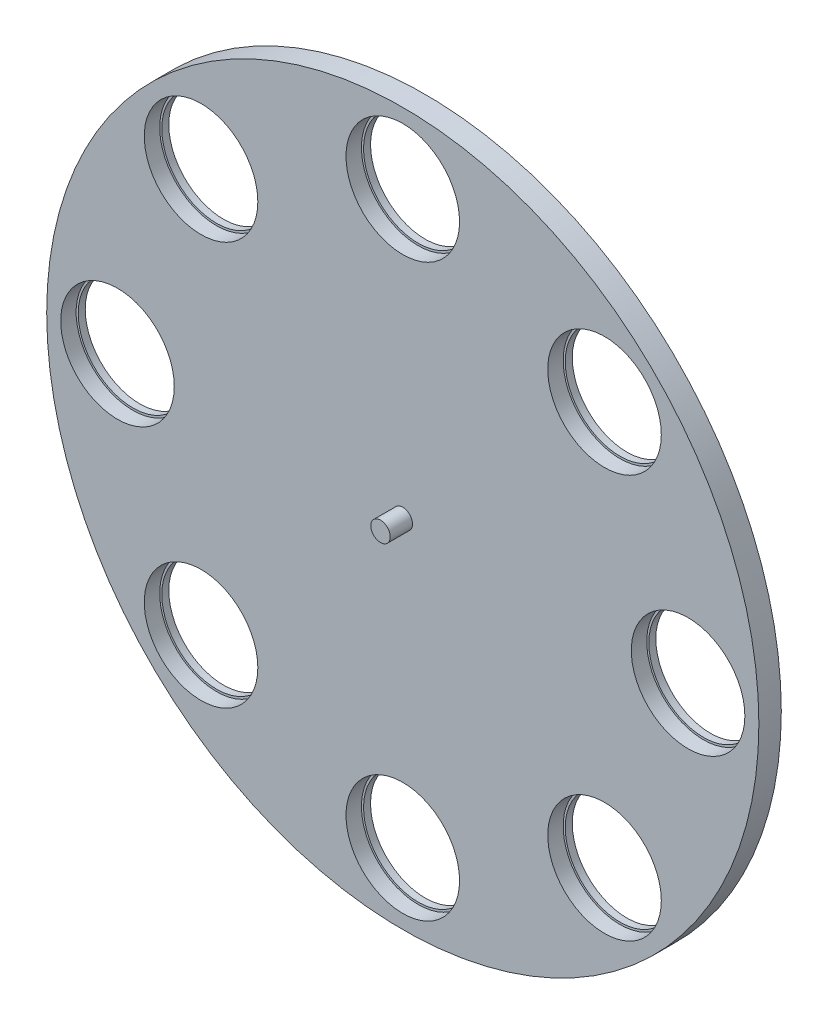
ISO-10303-21;
HEADER;
FILE_DESCRIPTION(('STEP AP214'),'2;1');
FILE_NAME('part.step','',(''),(''),'','','');
FILE_SCHEMA(('AUTOMOTIVE_DESIGN { 1 0 10303 214 1 1 1 1 }'));
ENDSEC;
DATA;
#1=APPLICATION_CONTEXT('core data for automotive mechanical design processes');
#2=APPLICATION_PROTOCOL_DEFINITION('international standard','automotive_design',2000,#1);
#3=PRODUCT_CONTEXT('',#1,'mechanical');
#4=PRODUCT('Part','Part','',(#3));
#5=PRODUCT_RELATED_PRODUCT_CATEGORY('part','',(#4));
#6=PRODUCT_DEFINITION_FORMATION('','',#4);
#7=PRODUCT_DEFINITION_CONTEXT('part definition',#1,'design');
#8=PRODUCT_DEFINITION('design','',#6,#7);
#9=PRODUCT_DEFINITION_SHAPE('','',#8);
#10=(LENGTH_UNIT() NAMED_UNIT(*) SI_UNIT(.MILLI.,.METRE.));
#11=(NAMED_UNIT(*) PLANE_ANGLE_UNIT() SI_UNIT($,.RADIAN.));
#12=(NAMED_UNIT(*) SI_UNIT($,.STERADIAN.) SOLID_ANGLE_UNIT());
#13=UNCERTAINTY_MEASURE_WITH_UNIT(LENGTH_MEASURE(1.E-05),#10,'distance_accuracy_value','');
#14=(GEOMETRIC_REPRESENTATION_CONTEXT(3) GLOBAL_UNCERTAINTY_ASSIGNED_CONTEXT((#13)) GLOBAL_UNIT_ASSIGNED_CONTEXT((#10,
#11,#12)) REPRESENTATION_CONTEXT('',''));
#15=CARTESIAN_POINT('',(0.,0.,0.));
#16=DIRECTION('',(0.,0.,1.));
#17=DIRECTION('',(1.,0.,0.));
#18=AXIS2_PLACEMENT_3D('',#15,#16,#17);
#19=CARTESIAN_POINT('',(0.,0.,1.1));
#20=DIRECTION('',(0.,0.,1.));
#21=DIRECTION('',(1.,0.,0.));
#22=AXIS2_PLACEMENT_3D('',#19,#20,#21);
#23=PLANE('',#22);
#24=CARTESIAN_POINT('',(0.,0.,1.1));
#25=DIRECTION('',(0.,0.,1.));
#26=DIRECTION('',(1.,0.,0.));
#27=AXIS2_PLACEMENT_3D('',#24,#25,#26);
#28=CIRCLE('',#27,0.69375);
#29=CARTESIAN_POINT('',(0.69375,0.,1.1));
#30=VERTEX_POINT('',#29);
#31=EDGE_CURVE('E104',#30,#30,#28,.T.);
#32=ORIENTED_EDGE('',*,*,#31,.F.);
#33=EDGE_LOOP('',(#32));
#34=FACE_BOUND('',#33,.T.);
#35=CARTESIAN_POINT('',(-20.3499999999993,-7.18332019120938E-13,1.1));
#36=DIRECTION('',(0.,0.,1.));
#37=DIRECTION('',(1.,0.,0.));
#38=AXIS2_PLACEMENT_3D('',#35,#36,#37);
#39=CIRCLE('',#38,4.05);
#40=CARTESIAN_POINT('',(-16.2999999999993,-7.18332019120938E-13,1.1));
#41=VERTEX_POINT('',#40);
#42=EDGE_CURVE('E89',#41,#41,#39,.T.);
#43=ORIENTED_EDGE('',*,*,#42,.F.);
#44=EDGE_LOOP('',(#43));
#45=FACE_BOUND('',#44,.T.);
#46=CARTESIAN_POINT('',(1.43167972576935E-12,-20.35,1.1));
#47=DIRECTION('',(0.,0.,1.));
#48=DIRECTION('',(1.,0.,0.));
#49=AXIS2_PLACEMENT_3D('',#46,#47,#48);
#50=CIRCLE('',#49,4.05);
#51=CARTESIAN_POINT('',(4.05000000000143,-20.35,1.1));
#52=VERTEX_POINT('',#51);
#53=EDGE_CURVE('E77',#52,#52,#50,.T.);
#54=ORIENTED_EDGE('',*,*,#53,.F.);
#55=EDGE_LOOP('',(#54));
#56=FACE_BOUND('',#55,.T.);
#57=CARTESIAN_POINT('',(20.3500000000007,7.15839862884673E-13,1.1));
#58=DIRECTION('',(0.,0.,1.));
#59=DIRECTION('',(1.,0.,0.));
#60=AXIS2_PLACEMENT_3D('',#57,#58,#59);
#61=CIRCLE('',#60,4.05);
#62=CARTESIAN_POINT('',(24.4000000000007,7.15839862884673E-13,1.1));
#63=VERTEX_POINT('',#62);
#64=EDGE_CURVE('E65',#63,#63,#61,.T.);
#65=ORIENTED_EDGE('',*,*,#64,.F.);
#66=EDGE_LOOP('',(#65));
#67=FACE_BOUND('',#66,.T.);
#68=CARTESIAN_POINT('',(0.,20.35,1.1));
#69=DIRECTION('',(0.,0.,1.));
#70=DIRECTION('',(1.,0.,0.));
#71=AXIS2_PLACEMENT_3D('',#68,#69,#70);
#72=CIRCLE('',#71,4.05);
#73=CARTESIAN_POINT('',(4.05,20.35,1.1));
#74=VERTEX_POINT('',#73);
#75=EDGE_CURVE('E51',#74,#74,#72,.T.);
#76=ORIENTED_EDGE('',*,*,#75,.F.);
#77=EDGE_LOOP('',(#76));
#78=FACE_BOUND('',#77,.T.);
#79=CARTESIAN_POINT('',(0.,0.,1.1));
#80=DIRECTION('',(0.,0.,1.));
#81=DIRECTION('',(1.,0.,0.));
#82=AXIS2_PLACEMENT_3D('',#79,#80,#81);
#83=CIRCLE('',#82,25.4);
#84=CARTESIAN_POINT('',(25.4,0.,1.1));
#85=VERTEX_POINT('',#84);
#86=EDGE_CURVE('E12',#85,#85,#83,.T.);
#87=ORIENTED_EDGE('',*,*,#86,.T.);
#88=EDGE_LOOP('',(#87));
#89=FACE_BOUND('',#88,.T.);
#90=CARTESIAN_POINT('',(14.3896229971464,14.3896229971468,1.1));
#91=DIRECTION('',(0.,0.,1.));
#92=DIRECTION('',(1.,0.,0.));
#93=AXIS2_PLACEMENT_3D('',#90,#91,#92);
#94=CIRCLE('',#93,4.05);
#95=CARTESIAN_POINT('',(18.4396229971465,14.3896229971468,1.1));
#96=VERTEX_POINT('',#95);
#97=EDGE_CURVE('E60',#96,#96,#94,.T.);
#98=ORIENTED_EDGE('',*,*,#97,.F.);
#99=EDGE_LOOP('',(#98));
#100=FACE_BOUND('',#99,.T.);
#101=CARTESIAN_POINT('',(14.3896229971475,-14.3896229971457,1.1));
#102=DIRECTION('',(0.,0.,1.));
#103=DIRECTION('',(1.,0.,0.));
#104=AXIS2_PLACEMENT_3D('',#101,#102,#103);
#105=CIRCLE('',#104,4.05);
#106=CARTESIAN_POINT('',(18.4396229971475,-14.3896229971457,1.1));
#107=VERTEX_POINT('',#106);
#108=EDGE_CURVE('E71',#107,#107,#105,.T.);
#109=ORIENTED_EDGE('',*,*,#108,.F.);
#110=EDGE_LOOP('',(#109));
#111=FACE_BOUND('',#110,.T.);
#112=CARTESIAN_POINT('',(-14.389622997145,-14.3896229971468,1.1));
#113=DIRECTION('',(0.,0.,1.));
#114=DIRECTION('',(1.,0.,0.));
#115=AXIS2_PLACEMENT_3D('',#112,#113,#114);
#116=CIRCLE('',#115,4.05);
#117=CARTESIAN_POINT('',(-10.339622997145,-14.3896229971468,1.1));
#118=VERTEX_POINT('',#117);
#119=EDGE_CURVE('E83',#118,#118,#116,.T.);
#120=ORIENTED_EDGE('',*,*,#119,.F.);
#121=EDGE_LOOP('',(#120));
#122=FACE_BOUND('',#121,.T.);
#123=CARTESIAN_POINT('',(-14.389622997146,14.3896229971457,1.1));
#124=DIRECTION('',(0.,0.,1.));
#125=DIRECTION('',(1.,0.,0.));
#126=AXIS2_PLACEMENT_3D('',#123,#124,#125);
#127=CIRCLE('',#126,4.05);
#128=CARTESIAN_POINT('',(-10.339622997146,14.3896229971457,1.1));
#129=VERTEX_POINT('',#128);
#130=EDGE_CURVE('E95',#129,#129,#127,.T.);
#131=ORIENTED_EDGE('',*,*,#130,.F.);
#132=EDGE_LOOP('',(#131));
#133=FACE_BOUND('',#132,.T.);
#134=ADVANCED_FACE('F44',(#34,#45,#56,#67,#78,#89,#100,#111,#122,#133),#23,.T.);
#135=CARTESIAN_POINT('',(0.,0.,1.1));
#136=DIRECTION('',(0.,0.,-1.));
#137=DIRECTION('',(-1.,0.,0.));
#138=AXIS2_PLACEMENT_3D('',#135,#136,#137);
#139=CYLINDRICAL_SURFACE('',#138,25.4);
#140=ORIENTED_EDGE('',*,*,#86,.F.);
#141=EDGE_LOOP('',(#140));
#142=FACE_BOUND('',#141,.T.);
#143=CARTESIAN_POINT('',(0.,0.,-0.5));
#144=DIRECTION('',(0.,0.,-1.));
#145=DIRECTION('',(-1.,0.,0.));
#146=AXIS2_PLACEMENT_3D('',#143,#144,#145);
#147=CIRCLE('',#146,25.4);
#148=CARTESIAN_POINT('',(-25.4,0.,-0.5));
#149=VERTEX_POINT('',#148);
#150=EDGE_CURVE('E107',#149,#149,#147,.T.);
#151=ORIENTED_EDGE('',*,*,#150,.F.);
#152=EDGE_LOOP('',(#151));
#153=FACE_BOUND('',#152,.T.);
#154=ADVANCED_FACE('F46',(#142,#153),#139,.T.);
#155=CARTESIAN_POINT('',(0.,20.35,1.1));
#156=DIRECTION('',(0.,0.,-1.));
#157=DIRECTION('',(-1.,0.,0.));
#158=AXIS2_PLACEMENT_3D('',#155,#156,#157);
#159=CYLINDRICAL_SURFACE('',#158,4.05);
#160=ORIENTED_EDGE('',*,*,#75,.T.);
#161=EDGE_LOOP('',(#160));
#162=FACE_BOUND('',#161,.T.);
#163=CARTESIAN_POINT('',(0.,20.35,0.));
#164=DIRECTION('',(0.,0.,1.));
#165=DIRECTION('',(1.,0.,0.));
#166=AXIS2_PLACEMENT_3D('',#163,#164,#165);
#167=CIRCLE('',#166,4.05);
#168=CARTESIAN_POINT('',(4.05,20.35,0.));
#169=VERTEX_POINT('',#168);
#170=EDGE_CURVE('E55',#169,#169,#167,.T.);
#171=ORIENTED_EDGE('',*,*,#170,.F.);
#172=EDGE_LOOP('',(#171));
#173=FACE_BOUND('',#172,.T.);
#174=ADVANCED_FACE('F188',(#162,#173),#159,.F.);
#175=CARTESIAN_POINT('',(14.3896229971464,14.3896229971468,1.1));
#176=DIRECTION('',(0.,0.,-1.));
#177=DIRECTION('',(-1.,0.,0.));
#178=AXIS2_PLACEMENT_3D('',#175,#176,#177);
#179=CYLINDRICAL_SURFACE('',#178,4.05);
#180=ORIENTED_EDGE('',*,*,#97,.T.);
#181=EDGE_LOOP('',(#180));
#182=FACE_BOUND('',#181,.T.);
#183=CARTESIAN_POINT('',(14.3896229971464,14.3896229971468,0.));
#184=DIRECTION('',(0.,0.,1.));
#185=DIRECTION('',(1.,0.,0.));
#186=AXIS2_PLACEMENT_3D('',#183,#184,#185);
#187=CIRCLE('',#186,4.05);
#188=CARTESIAN_POINT('',(18.4396229971465,14.3896229971468,0.));
#189=VERTEX_POINT('',#188);
#190=EDGE_CURVE('E62',#189,#189,#187,.T.);
#191=ORIENTED_EDGE('',*,*,#190,.F.);
#192=EDGE_LOOP('',(#191));
#193=FACE_BOUND('',#192,.T.);
#194=ADVANCED_FACE('F195',(#182,#193),#179,.F.);
#195=CARTESIAN_POINT('',(20.3500000000007,7.15839862884673E-13,1.1));
#196=DIRECTION('',(0.,0.,-1.));
#197=DIRECTION('',(-1.,0.,0.));
#198=AXIS2_PLACEMENT_3D('',#195,#196,#197);
#199=CYLINDRICAL_SURFACE('',#198,4.05);
#200=ORIENTED_EDGE('',*,*,#64,.T.);
#201=EDGE_LOOP('',(#200));
#202=FACE_BOUND('',#201,.T.);
#203=CARTESIAN_POINT('',(20.3500000000007,7.15839862884673E-13,0.));
#204=DIRECTION('',(0.,0.,1.));
#205=DIRECTION('',(1.,0.,0.));
#206=AXIS2_PLACEMENT_3D('',#203,#204,#205);
#207=CIRCLE('',#206,4.05);
#208=CARTESIAN_POINT('',(24.4000000000007,7.15839862884673E-13,0.));
#209=VERTEX_POINT('',#208);
#210=EDGE_CURVE('E68',#209,#209,#207,.T.);
#211=ORIENTED_EDGE('',*,*,#210,.F.);
#212=EDGE_LOOP('',(#211));
#213=FACE_BOUND('',#212,.T.);
#214=ADVANCED_FACE('F198',(#202,#213),#199,.F.);
#215=CARTESIAN_POINT('',(14.3896229971475,-14.3896229971457,1.1));
#216=DIRECTION('',(0.,0.,-1.));
#217=DIRECTION('',(-1.,0.,0.));
#218=AXIS2_PLACEMENT_3D('',#215,#216,#217);
#219=CYLINDRICAL_SURFACE('',#218,4.05);
#220=ORIENTED_EDGE('',*,*,#108,.T.);
#221=EDGE_LOOP('',(#220));
#222=FACE_BOUND('',#221,.T.);
#223=CARTESIAN_POINT('',(14.3896229971475,-14.3896229971457,0.));
#224=DIRECTION('',(0.,0.,1.));
#225=DIRECTION('',(1.,0.,0.));
#226=AXIS2_PLACEMENT_3D('',#223,#224,#225);
#227=CIRCLE('',#226,4.05);
#228=CARTESIAN_POINT('',(18.4396229971475,-14.3896229971457,0.));
#229=VERTEX_POINT('',#228);
#230=EDGE_CURVE('E74',#229,#229,#227,.T.);
#231=ORIENTED_EDGE('',*,*,#230,.F.);
#232=EDGE_LOOP('',(#231));
#233=FACE_BOUND('',#232,.T.);
#234=ADVANCED_FACE('F202',(#222,#233),#219,.F.);
#235=CARTESIAN_POINT('',(1.43167972576935E-12,-20.35,1.1));
#236=DIRECTION('',(0.,0.,-1.));
#237=DIRECTION('',(-1.,0.,0.));
#238=AXIS2_PLACEMENT_3D('',#235,#236,#237);
#239=CYLINDRICAL_SURFACE('',#238,4.05);
#240=ORIENTED_EDGE('',*,*,#53,.T.);
#241=EDGE_LOOP('',(#240));
#242=FACE_BOUND('',#241,.T.);
#243=CARTESIAN_POINT('',(1.43167972576935E-12,-20.35,0.));
#244=DIRECTION('',(0.,0.,1.));
#245=DIRECTION('',(1.,0.,0.));
#246=AXIS2_PLACEMENT_3D('',#243,#244,#245);
#247=CIRCLE('',#246,4.05);
#248=CARTESIAN_POINT('',(4.05000000000143,-20.35,0.));
#249=VERTEX_POINT('',#248);
#250=EDGE_CURVE('E80',#249,#249,#247,.T.);
#251=ORIENTED_EDGE('',*,*,#250,.F.);
#252=EDGE_LOOP('',(#251));
#253=FACE_BOUND('',#252,.T.);
#254=ADVANCED_FACE('F206',(#242,#253),#239,.F.);
#255=CARTESIAN_POINT('',(-14.389622997145,-14.3896229971468,1.1));
#256=DIRECTION('',(0.,0.,-1.));
#257=DIRECTION('',(-1.,0.,0.));
#258=AXIS2_PLACEMENT_3D('',#255,#256,#257);
#259=CYLINDRICAL_SURFACE('',#258,4.05);
#260=ORIENTED_EDGE('',*,*,#119,.T.);
#261=EDGE_LOOP('',(#260));
#262=FACE_BOUND('',#261,.T.);
#263=CARTESIAN_POINT('',(-14.389622997145,-14.3896229971468,0.));
#264=DIRECTION('',(0.,0.,1.));
#265=DIRECTION('',(1.,0.,0.));
#266=AXIS2_PLACEMENT_3D('',#263,#264,#265);
#267=CIRCLE('',#266,4.05);
#268=CARTESIAN_POINT('',(-10.339622997145,-14.3896229971468,0.));
#269=VERTEX_POINT('',#268);
#270=EDGE_CURVE('E86',#269,#269,#267,.T.);
#271=ORIENTED_EDGE('',*,*,#270,.F.);
#272=EDGE_LOOP('',(#271));
#273=FACE_BOUND('',#272,.T.);
#274=ADVANCED_FACE('F210',(#262,#273),#259,.F.);
#275=CARTESIAN_POINT('',(-20.3499999999993,-7.18332019120938E-13,1.1));
#276=DIRECTION('',(0.,0.,-1.));
#277=DIRECTION('',(-1.,0.,0.));
#278=AXIS2_PLACEMENT_3D('',#275,#276,#277);
#279=CYLINDRICAL_SURFACE('',#278,4.05);
#280=ORIENTED_EDGE('',*,*,#42,.T.);
#281=EDGE_LOOP('',(#280));
#282=FACE_BOUND('',#281,.T.);
#283=CARTESIAN_POINT('',(-20.3499999999993,-7.18332019120938E-13,0.));
#284=DIRECTION('',(0.,0.,1.));
#285=DIRECTION('',(1.,0.,0.));
#286=AXIS2_PLACEMENT_3D('',#283,#284,#285);
#287=CIRCLE('',#286,4.05);
#288=CARTESIAN_POINT('',(-16.2999999999993,-7.18332019120938E-13,0.));
#289=VERTEX_POINT('',#288);
#290=EDGE_CURVE('E92',#289,#289,#287,.T.);
#291=ORIENTED_EDGE('',*,*,#290,.F.);
#292=EDGE_LOOP('',(#291));
#293=FACE_BOUND('',#292,.T.);
#294=ADVANCED_FACE('F214',(#282,#293),#279,.F.);
#295=CARTESIAN_POINT('',(-14.389622997146,14.3896229971457,1.1));
#296=DIRECTION('',(0.,0.,-1.));
#297=DIRECTION('',(-1.,0.,0.));
#298=AXIS2_PLACEMENT_3D('',#295,#296,#297);
#299=CYLINDRICAL_SURFACE('',#298,4.05);
#300=ORIENTED_EDGE('',*,*,#130,.T.);
#301=EDGE_LOOP('',(#300));
#302=FACE_BOUND('',#301,.T.);
#303=CARTESIAN_POINT('',(-14.389622997146,14.3896229971457,0.));
#304=DIRECTION('',(0.,0.,1.));
#305=DIRECTION('',(1.,0.,0.));
#306=AXIS2_PLACEMENT_3D('',#303,#304,#305);
#307=CIRCLE('',#306,4.05);
#308=CARTESIAN_POINT('',(-10.339622997146,14.3896229971457,0.));
#309=VERTEX_POINT('',#308);
#310=EDGE_CURVE('E98',#309,#309,#307,.T.);
#311=ORIENTED_EDGE('',*,*,#310,.F.);
#312=EDGE_LOOP('',(#311));
#313=FACE_BOUND('',#312,.T.);
#314=ADVANCED_FACE('F218',(#302,#313),#299,.F.);
#315=CARTESIAN_POINT('',(0.,0.,2.6875));
#316=DIRECTION('',(0.,0.,-1.));
#317=DIRECTION('',(-1.,0.,0.));
#318=AXIS2_PLACEMENT_3D('',#315,#316,#317);
#319=CYLINDRICAL_SURFACE('',#318,0.69375);
#320=CARTESIAN_POINT('',(0.,0.,2.6875));
#321=DIRECTION('',(0.,0.,1.));
#322=DIRECTION('',(1.,0.,0.));
#323=AXIS2_PLACEMENT_3D('',#320,#321,#322);
#324=CIRCLE('',#323,0.69375);
#325=CARTESIAN_POINT('',(0.69375,0.,2.6875));
#326=VERTEX_POINT('',#325);
#327=EDGE_CURVE('E101',#326,#326,#324,.T.);
#328=ORIENTED_EDGE('',*,*,#327,.F.);
#329=EDGE_LOOP('',(#328));
#330=FACE_BOUND('',#329,.T.);
#331=ORIENTED_EDGE('',*,*,#31,.T.);
#332=EDGE_LOOP('',(#331));
#333=FACE_BOUND('',#332,.T.);
#334=ADVANCED_FACE('F222',(#330,#333),#319,.T.);
#335=CARTESIAN_POINT('',(0.,0.,2.6875));
#336=DIRECTION('',(0.,0.,1.));
#337=DIRECTION('',(1.,0.,0.));
#338=AXIS2_PLACEMENT_3D('',#335,#336,#337);
#339=PLANE('',#338);
#340=ORIENTED_EDGE('',*,*,#327,.T.);
#341=EDGE_LOOP('',(#340));
#342=FACE_BOUND('',#341,.T.);
#343=ADVANCED_FACE('F226',(#342),#339,.T.);
#344=CARTESIAN_POINT('',(0.,0.,0.));
#345=DIRECTION('',(0.,0.,-1.));
#346=DIRECTION('',(-1.,0.,0.));
#347=AXIS2_PLACEMENT_3D('',#344,#345,#346);
#348=PLANE('',#347);
#349=CARTESIAN_POINT('',(0.,20.35,0.));
#350=DIRECTION('',(0.,0.,-1.));
#351=DIRECTION('',(-1.,0.,0.));
#352=AXIS2_PLACEMENT_3D('',#349,#350,#351);
#353=CIRCLE('',#352,3.9);
#354=CARTESIAN_POINT('',(-3.9,20.35,0.));
#355=VERTEX_POINT('',#354);
#356=EDGE_CURVE('E113',#355,#355,#353,.T.);
#357=ORIENTED_EDGE('',*,*,#356,.T.);
#358=EDGE_LOOP('',(#357));
#359=FACE_BOUND('',#358,.T.);
#360=ORIENTED_EDGE('',*,*,#170,.T.);
#361=EDGE_LOOP('',(#360));
#362=FACE_BOUND('',#361,.T.);
#363=ADVANCED_FACE('F180',(#359,#362),#348,.F.);
#364=CARTESIAN_POINT('',(14.389622997146,14.3896229971456,0.));
#365=DIRECTION('',(0.,0.,-1.));
#366=DIRECTION('',(-1.,0.,0.));
#367=AXIS2_PLACEMENT_3D('',#364,#365,#366);
#368=CIRCLE('',#367,3.90000000000066);
#369=CARTESIAN_POINT('',(10.4896229971453,14.3896229971456,0.));
#370=VERTEX_POINT('',#369);
#371=EDGE_CURVE('E155',#370,#370,#368,.T.);
#372=ORIENTED_EDGE('',*,*,#371,.T.);
#373=EDGE_LOOP('',(#372));
#374=FACE_BOUND('',#373,.T.);
#375=ORIENTED_EDGE('',*,*,#190,.T.);
#376=EDGE_LOOP('',(#375));
#377=FACE_BOUND('',#376,.T.);
#378=ADVANCED_FACE('F231',(#374,#377),#348,.F.);
#379=CARTESIAN_POINT('',(20.3499999999991,-8.6632660224495E-13,0.));
#380=DIRECTION('',(0.,0.,-1.));
#381=DIRECTION('',(-1.,0.,0.));
#382=AXIS2_PLACEMENT_3D('',#379,#380,#381);
#383=CIRCLE('',#382,3.90000000000128);
#384=CARTESIAN_POINT('',(16.4499999999979,-8.6632660224495E-13,0.));
#385=VERTEX_POINT('',#384);
#386=EDGE_CURVE('E149',#385,#385,#383,.T.);
#387=ORIENTED_EDGE('',*,*,#386,.T.);
#388=EDGE_LOOP('',(#387));
#389=FACE_BOUND('',#388,.T.);
#390=ORIENTED_EDGE('',*,*,#210,.T.);
#391=EDGE_LOOP('',(#390));
#392=FACE_BOUND('',#391,.T.);
#393=ADVANCED_FACE('F236',(#389,#392),#348,.F.);
#394=CARTESIAN_POINT('',(14.3896229971448,-14.3896229971469,0.));
#395=DIRECTION('',(0.,0.,-1.));
#396=DIRECTION('',(-1.,0.,0.));
#397=AXIS2_PLACEMENT_3D('',#394,#395,#396);
#398=CIRCLE('',#397,3.90000000000176);
#399=CARTESIAN_POINT('',(10.489622997143,-14.3896229971469,0.));
#400=VERTEX_POINT('',#399);
#401=EDGE_CURVE('E143',#400,#400,#398,.T.);
#402=ORIENTED_EDGE('',*,*,#401,.T.);
#403=EDGE_LOOP('',(#402));
#404=FACE_BOUND('',#403,.T.);
#405=ORIENTED_EDGE('',*,*,#230,.T.);
#406=EDGE_LOOP('',(#405));
#407=FACE_BOUND('',#406,.T.);
#408=ADVANCED_FACE('F246',(#404,#407),#348,.F.);
#409=CARTESIAN_POINT('',(-1.72766889201737E-12,-20.35,0.));
#410=DIRECTION('',(0.,0.,-1.));
#411=DIRECTION('',(-1.,0.,0.));
#412=AXIS2_PLACEMENT_3D('',#409,#410,#411);
#413=CIRCLE('',#412,3.90000000000179);
#414=CARTESIAN_POINT('',(-3.90000000000352,-20.35,0.));
#415=VERTEX_POINT('',#414);
#416=EDGE_CURVE('E137',#415,#415,#413,.T.);
#417=ORIENTED_EDGE('',*,*,#416,.T.);
#418=EDGE_LOOP('',(#417));
#419=FACE_BOUND('',#418,.T.);
#420=ORIENTED_EDGE('',*,*,#250,.T.);
#421=EDGE_LOOP('',(#420));
#422=FACE_BOUND('',#421,.T.);
#423=ADVANCED_FACE('F297',(#419,#422),#348,.F.);
#424=CARTESIAN_POINT('',(-14.3896229971477,-14.3896229971456,0.));
#425=DIRECTION('',(0.,0.,-1.));
#426=DIRECTION('',(-1.,0.,0.));
#427=AXIS2_PLACEMENT_3D('',#424,#425,#426);
#428=CIRCLE('',#427,3.90000000000133);
#429=CARTESIAN_POINT('',(-18.289622997149,-14.3896229971456,0.));
#430=VERTEX_POINT('',#429);
#431=EDGE_CURVE('E131',#430,#430,#428,.T.);
#432=ORIENTED_EDGE('',*,*,#431,.T.);
#433=EDGE_LOOP('',(#432));
#434=FACE_BOUND('',#433,.T.);
#435=ORIENTED_EDGE('',*,*,#270,.T.);
#436=EDGE_LOOP('',(#435));
#437=FACE_BOUND('',#436,.T.);
#438=ADVANCED_FACE('F303',(#434,#437),#348,.F.);
#439=CARTESIAN_POINT('',(-20.3500000000009,8.63834446008685E-13,0.));
#440=DIRECTION('',(0.,0.,-1.));
#441=DIRECTION('',(-1.,0.,0.));
#442=AXIS2_PLACEMENT_3D('',#439,#440,#441);
#443=CIRCLE('',#442,3.90000000000064);
#444=CARTESIAN_POINT('',(-24.2500000000015,8.63834446008685E-13,0.));
#445=VERTEX_POINT('',#444);
#446=EDGE_CURVE('E125',#445,#445,#443,.T.);
#447=ORIENTED_EDGE('',*,*,#446,.T.);
#448=EDGE_LOOP('',(#447));
#449=FACE_BOUND('',#448,.T.);
#450=ORIENTED_EDGE('',*,*,#290,.T.);
#451=EDGE_LOOP('',(#450));
#452=FACE_BOUND('',#451,.T.);
#453=ADVANCED_FACE('F177',(#449,#452),#348,.F.);
#454=CARTESIAN_POINT('',(-14.3896229971465,14.3896229971469,0.));
#455=DIRECTION('',(0.,0.,-1.));
#456=DIRECTION('',(-1.,0.,0.));
#457=AXIS2_PLACEMENT_3D('',#454,#455,#456);
#458=CIRCLE('',#457,3.9000000000001);
#459=CARTESIAN_POINT('',(-18.2896229971466,14.3896229971469,0.));
#460=VERTEX_POINT('',#459);
#461=EDGE_CURVE('E119',#460,#460,#458,.T.);
#462=ORIENTED_EDGE('',*,*,#461,.T.);
#463=EDGE_LOOP('',(#462));
#464=FACE_BOUND('',#463,.T.);
#465=ORIENTED_EDGE('',*,*,#310,.T.);
#466=EDGE_LOOP('',(#465));
#467=FACE_BOUND('',#466,.T.);
#468=ADVANCED_FACE('F167',(#464,#467),#348,.F.);
#469=CARTESIAN_POINT('',(0.,0.,-0.5));
#470=DIRECTION('',(0.,0.,-1.));
#471=DIRECTION('',(-1.,0.,0.));
#472=AXIS2_PLACEMENT_3D('',#469,#470,#471);
#473=PLANE('',#472);
#474=CARTESIAN_POINT('',(20.3499999999991,-8.6632660224495E-13,-0.5));
#475=DIRECTION('',(0.,0.,-1.));
#476=DIRECTION('',(-1.,0.,0.));
#477=AXIS2_PLACEMENT_3D('',#474,#475,#476);
#478=CIRCLE('',#477,3.90000000000128);
#479=CARTESIAN_POINT('',(16.4499999999979,-8.6632660224495E-13,-0.5));
#480=VERTEX_POINT('',#479);
#481=EDGE_CURVE('E146',#480,#480,#478,.T.);
#482=ORIENTED_EDGE('',*,*,#481,.F.);
#483=EDGE_LOOP('',(#482));
#484=FACE_BOUND('',#483,.T.);
#485=CARTESIAN_POINT('',(-1.72766889201737E-12,-20.35,-0.5));
#486=DIRECTION('',(0.,0.,-1.));
#487=DIRECTION('',(-1.,0.,0.));
#488=AXIS2_PLACEMENT_3D('',#485,#486,#487);
#489=CIRCLE('',#488,3.90000000000179);
#490=CARTESIAN_POINT('',(-3.90000000000352,-20.35,-0.5));
#491=VERTEX_POINT('',#490);
#492=EDGE_CURVE('E134',#491,#491,#489,.T.);
#493=ORIENTED_EDGE('',*,*,#492,.F.);
#494=EDGE_LOOP('',(#493));
#495=FACE_BOUND('',#494,.T.);
#496=CARTESIAN_POINT('',(-20.3500000000009,8.63834446008685E-13,-0.5));
#497=DIRECTION('',(0.,0.,-1.));
#498=DIRECTION('',(-1.,0.,0.));
#499=AXIS2_PLACEMENT_3D('',#496,#497,#498);
#500=CIRCLE('',#499,3.90000000000064);
#501=CARTESIAN_POINT('',(-24.2500000000015,8.63834446008685E-13,-0.5));
#502=VERTEX_POINT('',#501);
#503=EDGE_CURVE('E122',#502,#502,#500,.T.);
#504=ORIENTED_EDGE('',*,*,#503,.F.);
#505=EDGE_LOOP('',(#504));
#506=FACE_BOUND('',#505,.T.);
#507=CARTESIAN_POINT('',(0.,20.35,-0.5));
#508=DIRECTION('',(0.,0.,-1.));
#509=DIRECTION('',(-1.,0.,0.));
#510=AXIS2_PLACEMENT_3D('',#507,#508,#509);
#511=CIRCLE('',#510,3.9);
#512=CARTESIAN_POINT('',(-3.9,20.35,-0.5));
#513=VERTEX_POINT('',#512);
#514=EDGE_CURVE('E112',#513,#513,#511,.T.);
#515=ORIENTED_EDGE('',*,*,#514,.F.);
#516=EDGE_LOOP('',(#515));
#517=FACE_BOUND('',#516,.T.);
#518=ORIENTED_EDGE('',*,*,#150,.T.);
#519=EDGE_LOOP('',(#518));
#520=FACE_BOUND('',#519,.T.);
#521=CARTESIAN_POINT('',(-14.3896229971465,14.3896229971469,-0.5));
#522=DIRECTION('',(0.,0.,-1.));
#523=DIRECTION('',(-1.,0.,0.));
#524=AXIS2_PLACEMENT_3D('',#521,#522,#523);
#525=CIRCLE('',#524,3.9000000000001);
#526=CARTESIAN_POINT('',(-18.2896229971466,14.3896229971469,-0.5));
#527=VERTEX_POINT('',#526);
#528=EDGE_CURVE('E116',#527,#527,#525,.T.);
#529=ORIENTED_EDGE('',*,*,#528,.F.);
#530=EDGE_LOOP('',(#529));
#531=FACE_BOUND('',#530,.T.);
#532=CARTESIAN_POINT('',(-14.3896229971477,-14.3896229971456,-0.5));
#533=DIRECTION('',(0.,0.,-1.));
#534=DIRECTION('',(-1.,0.,0.));
#535=AXIS2_PLACEMENT_3D('',#532,#533,#534);
#536=CIRCLE('',#535,3.90000000000133);
#537=CARTESIAN_POINT('',(-18.289622997149,-14.3896229971456,-0.5));
#538=VERTEX_POINT('',#537);
#539=EDGE_CURVE('E128',#538,#538,#536,.T.);
#540=ORIENTED_EDGE('',*,*,#539,.F.);
#541=EDGE_LOOP('',(#540));
#542=FACE_BOUND('',#541,.T.);
#543=CARTESIAN_POINT('',(14.3896229971448,-14.3896229971469,-0.5));
#544=DIRECTION('',(0.,0.,-1.));
#545=DIRECTION('',(-1.,0.,0.));
#546=AXIS2_PLACEMENT_3D('',#543,#544,#545);
#547=CIRCLE('',#546,3.90000000000176);
#548=CARTESIAN_POINT('',(10.489622997143,-14.3896229971469,-0.5));
#549=VERTEX_POINT('',#548);
#550=EDGE_CURVE('E140',#549,#549,#547,.T.);
#551=ORIENTED_EDGE('',*,*,#550,.F.);
#552=EDGE_LOOP('',(#551));
#553=FACE_BOUND('',#552,.T.);
#554=CARTESIAN_POINT('',(14.389622997146,14.3896229971456,-0.5));
#555=DIRECTION('',(0.,0.,-1.));
#556=DIRECTION('',(-1.,0.,0.));
#557=AXIS2_PLACEMENT_3D('',#554,#555,#556);
#558=CIRCLE('',#557,3.90000000000066);
#559=CARTESIAN_POINT('',(10.4896229971453,14.3896229971456,-0.5));
#560=VERTEX_POINT('',#559);
#561=EDGE_CURVE('E152',#560,#560,#558,.T.);
#562=ORIENTED_EDGE('',*,*,#561,.F.);
#563=EDGE_LOOP('',(#562));
#564=FACE_BOUND('',#563,.T.);
#565=ADVANCED_FACE('F164',(#484,#495,#506,#517,#520,#531,#542,#553,#564),#473,.T.);
#566=CARTESIAN_POINT('',(0.,20.35,-0.5));
#567=DIRECTION('',(0.,0.,1.));
#568=DIRECTION('',(1.,0.,0.));
#569=AXIS2_PLACEMENT_3D('',#566,#567,#568);
#570=CYLINDRICAL_SURFACE('',#569,3.9);
#571=ORIENTED_EDGE('',*,*,#514,.T.);
#572=EDGE_LOOP('',(#571));
#573=FACE_BOUND('',#572,.T.);
#574=ORIENTED_EDGE('',*,*,#356,.F.);
#575=EDGE_LOOP('',(#574));
#576=FACE_BOUND('',#575,.T.);
#577=ADVANCED_FACE('F166',(#573,#576),#570,.F.);
#578=CARTESIAN_POINT('',(-14.3896229971465,14.3896229971469,-0.5));
#579=DIRECTION('',(0.,0.,1.));
#580=DIRECTION('',(1.,0.,0.));
#581=AXIS2_PLACEMENT_3D('',#578,#579,#580);
#582=CYLINDRICAL_SURFACE('',#581,3.9000000000001);
#583=ORIENTED_EDGE('',*,*,#528,.T.);
#584=EDGE_LOOP('',(#583));
#585=FACE_BOUND('',#584,.T.);
#586=ORIENTED_EDGE('',*,*,#461,.F.);
#587=EDGE_LOOP('',(#586));
#588=FACE_BOUND('',#587,.T.);
#589=ADVANCED_FACE('F174',(#585,#588),#582,.F.);
#590=CARTESIAN_POINT('',(-20.3500000000009,8.63834446008685E-13,-0.5));
#591=DIRECTION('',(0.,0.,1.));
#592=DIRECTION('',(1.,0.,0.));
#593=AXIS2_PLACEMENT_3D('',#590,#591,#592);
#594=CYLINDRICAL_SURFACE('',#593,3.90000000000064);
#595=ORIENTED_EDGE('',*,*,#503,.T.);
#596=EDGE_LOOP('',(#595));
#597=FACE_BOUND('',#596,.T.);
#598=ORIENTED_EDGE('',*,*,#446,.F.);
#599=EDGE_LOOP('',(#598));
#600=FACE_BOUND('',#599,.T.);
#601=ADVANCED_FACE('F272',(#597,#600),#594,.F.);
#602=CARTESIAN_POINT('',(-14.3896229971477,-14.3896229971456,-0.5));
#603=DIRECTION('',(0.,0.,1.));
#604=DIRECTION('',(1.,0.,0.));
#605=AXIS2_PLACEMENT_3D('',#602,#603,#604);
#606=CYLINDRICAL_SURFACE('',#605,3.90000000000133);
#607=ORIENTED_EDGE('',*,*,#539,.T.);
#608=EDGE_LOOP('',(#607));
#609=FACE_BOUND('',#608,.T.);
#610=ORIENTED_EDGE('',*,*,#431,.F.);
#611=EDGE_LOOP('',(#610));
#612=FACE_BOUND('',#611,.T.);
#613=ADVANCED_FACE('F268',(#609,#612),#606,.F.);
#614=CARTESIAN_POINT('',(-1.72766889201737E-12,-20.35,-0.5));
#615=DIRECTION('',(0.,0.,1.));
#616=DIRECTION('',(1.,0.,0.));
#617=AXIS2_PLACEMENT_3D('',#614,#615,#616);
#618=CYLINDRICAL_SURFACE('',#617,3.90000000000179);
#619=ORIENTED_EDGE('',*,*,#492,.T.);
#620=EDGE_LOOP('',(#619));
#621=FACE_BOUND('',#620,.T.);
#622=ORIENTED_EDGE('',*,*,#416,.F.);
#623=EDGE_LOOP('',(#622));
#624=FACE_BOUND('',#623,.T.);
#625=ADVANCED_FACE('F264',(#621,#624),#618,.F.);
#626=CARTESIAN_POINT('',(14.3896229971448,-14.3896229971469,-0.5));
#627=DIRECTION('',(0.,0.,1.));
#628=DIRECTION('',(1.,0.,0.));
#629=AXIS2_PLACEMENT_3D('',#626,#627,#628);
#630=CYLINDRICAL_SURFACE('',#629,3.90000000000176);
#631=ORIENTED_EDGE('',*,*,#550,.T.);
#632=EDGE_LOOP('',(#631));
#633=FACE_BOUND('',#632,.T.);
#634=ORIENTED_EDGE('',*,*,#401,.F.);
#635=EDGE_LOOP('',(#634));
#636=FACE_BOUND('',#635,.T.);
#637=ADVANCED_FACE('F258',(#633,#636),#630,.F.);
#638=CARTESIAN_POINT('',(20.3499999999991,-8.6632660224495E-13,-0.5));
#639=DIRECTION('',(0.,0.,1.));
#640=DIRECTION('',(1.,0.,0.));
#641=AXIS2_PLACEMENT_3D('',#638,#639,#640);
#642=CYLINDRICAL_SURFACE('',#641,3.90000000000128);
#643=ORIENTED_EDGE('',*,*,#481,.T.);
#644=EDGE_LOOP('',(#643));
#645=FACE_BOUND('',#644,.T.);
#646=ORIENTED_EDGE('',*,*,#386,.F.);
#647=EDGE_LOOP('',(#646));
#648=FACE_BOUND('',#647,.T.);
#649=ADVANCED_FACE('F253',(#645,#648),#642,.F.);
#650=CARTESIAN_POINT('',(14.389622997146,14.3896229971456,-0.5));
#651=DIRECTION('',(0.,0.,1.));
#652=DIRECTION('',(1.,0.,0.));
#653=AXIS2_PLACEMENT_3D('',#650,#651,#652);
#654=CYLINDRICAL_SURFACE('',#653,3.90000000000066);
#655=ORIENTED_EDGE('',*,*,#561,.T.);
#656=EDGE_LOOP('',(#655));
#657=FACE_BOUND('',#656,.T.);
#658=ORIENTED_EDGE('',*,*,#371,.F.);
#659=EDGE_LOOP('',(#658));
#660=FACE_BOUND('',#659,.T.);
#661=ADVANCED_FACE('F161',(#657,#660),#654,.F.);
#662=CLOSED_SHELL('',(#134,#154,#174,#194,#214,#234,#254,#274,#294,#314,#334,#343,#363,#378,
#393,#408,#423,#438,#453,#468,#565,#577,#589,#601,#613,#625,#637,#649,#661));
#663=MANIFOLD_SOLID_BREP('B2',#662);
#664=ADVANCED_BREP_SHAPE_REPRESENTATION('',(#18,#663),#14);
#665=SHAPE_DEFINITION_REPRESENTATION(#9,#664);
ENDSEC;
END-ISO-10303-21;
